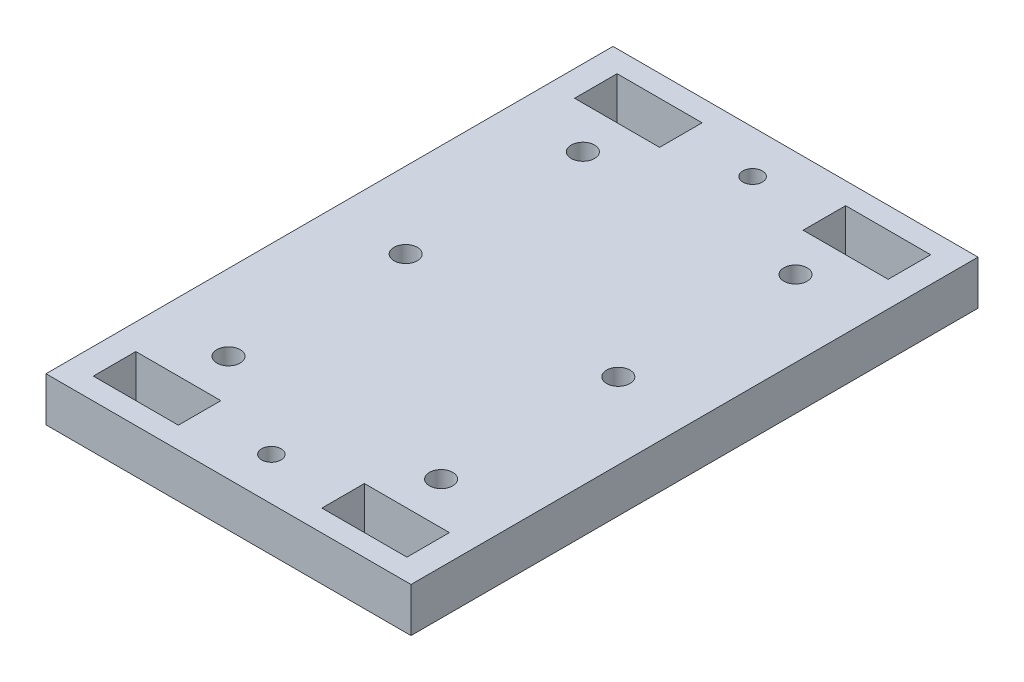
ISO-10303-21;
HEADER;
FILE_DESCRIPTION(('STEP AP214'),'2;1');
FILE_NAME('part.step','',(''),(''),'','','');
FILE_SCHEMA(('AUTOMOTIVE_DESIGN { 1 0 10303 214 1 1 1 1 }'));
ENDSEC;
DATA;
#1=APPLICATION_CONTEXT('core data for automotive mechanical design processes');
#2=APPLICATION_PROTOCOL_DEFINITION('international standard','automotive_design',2000,#1);
#3=PRODUCT_CONTEXT('',#1,'mechanical');
#4=PRODUCT('Part','Part','',(#3));
#5=PRODUCT_RELATED_PRODUCT_CATEGORY('part','',(#4));
#6=PRODUCT_DEFINITION_FORMATION('','',#4);
#7=PRODUCT_DEFINITION_CONTEXT('part definition',#1,'design');
#8=PRODUCT_DEFINITION('design','',#6,#7);
#9=PRODUCT_DEFINITION_SHAPE('','',#8);
#10=(LENGTH_UNIT() NAMED_UNIT(*) SI_UNIT(.MILLI.,.METRE.));
#11=(NAMED_UNIT(*) PLANE_ANGLE_UNIT() SI_UNIT($,.RADIAN.));
#12=(NAMED_UNIT(*) SI_UNIT($,.STERADIAN.) SOLID_ANGLE_UNIT());
#13=UNCERTAINTY_MEASURE_WITH_UNIT(LENGTH_MEASURE(1.E-05),#10,'distance_accuracy_value','');
#14=(GEOMETRIC_REPRESENTATION_CONTEXT(3) GLOBAL_UNCERTAINTY_ASSIGNED_CONTEXT((#13)) GLOBAL_UNIT_ASSIGNED_CONTEXT((#10,
#11,#12)) REPRESENTATION_CONTEXT('',''));
#15=CARTESIAN_POINT('',(0.,0.,0.));
#16=DIRECTION('',(0.,0.,1.));
#17=DIRECTION('',(1.,0.,0.));
#18=AXIS2_PLACEMENT_3D('',#15,#16,#17);
#19=CARTESIAN_POINT('',(0.,6.25,0.));
#20=DIRECTION('',(0.,-1.,0.));
#21=DIRECTION('',(0.,0.,-1.));
#22=AXIS2_PLACEMENT_3D('',#19,#20,#21);
#23=PLANE('',#22);
#24=CARTESIAN_POINT('',(25.75,6.25,-73.95));
#25=DIRECTION('',(0.,1.,0.));
#26=DIRECTION('',(0.,0.,1.));
#27=AXIS2_PLACEMENT_3D('',#24,#25,#26);
#28=CIRCLE('',#27,1.375);
#29=CARTESIAN_POINT('',(25.75,6.25,-72.575));
#30=VERTEX_POINT('',#29);
#31=EDGE_CURVE('E198',#30,#30,#28,.T.);
#32=ORIENTED_EDGE('',*,*,#31,.F.);
#33=EDGE_LOOP('',(#32));
#34=FACE_BOUND('',#33,.T.);
#35=DIRECTION('',(-1.,0.,0.));
#36=VECTOR('',#35,1.);
#37=CARTESIAN_POINT('',(15.6250000000001,6.25,-76.95));
#38=LINE('',#37,#36);
#39=CARTESIAN_POINT('',(15.6250000000001,6.25,-76.95));
#40=VERTEX_POINT('',#39);
#41=CARTESIAN_POINT('',(3.62500000000013,6.25,-76.95));
#42=VERTEX_POINT('',#41);
#43=EDGE_CURVE('E208',#40,#42,#38,.T.);
#44=ORIENTED_EDGE('',*,*,#43,.F.);
#45=DIRECTION('',(0.,0.,-1.));
#46=VECTOR('',#45,1.);
#47=CARTESIAN_POINT('',(15.6250000000001,6.25,-76.95));
#48=LINE('',#47,#46);
#49=CARTESIAN_POINT('',(15.6250000000001,6.25,-70.95));
#50=VERTEX_POINT('',#49);
#51=EDGE_CURVE('E216',#50,#40,#48,.T.);
#52=ORIENTED_EDGE('',*,*,#51,.F.);
#53=DIRECTION('',(1.,0.,0.));
#54=VECTOR('',#53,1.);
#55=CARTESIAN_POINT('',(15.6250000000001,6.25,-70.95));
#56=LINE('',#55,#54);
#57=CARTESIAN_POINT('',(3.62500000000011,6.25,-70.9500000000001));
#58=VERTEX_POINT('',#57);
#59=EDGE_CURVE('E213',#58,#50,#56,.T.);
#60=ORIENTED_EDGE('',*,*,#59,.F.);
#61=DIRECTION('',(0.,0.,1.));
#62=VECTOR('',#61,1.);
#63=CARTESIAN_POINT('',(3.62500000000013,6.25,-76.95));
#64=LINE('',#63,#62);
#65=EDGE_CURVE('E210',#42,#58,#64,.T.);
#66=ORIENTED_EDGE('',*,*,#65,.F.);
#67=EDGE_LOOP('',(#44,#52,#60,#66));
#68=FACE_BOUND('',#67,.T.);
#69=CARTESIAN_POINT('',(10.7499999999999,6.25,-65.));
#70=DIRECTION('',(0.,1.,0.));
#71=DIRECTION('',(0.,0.,1.));
#72=AXIS2_PLACEMENT_3D('',#69,#70,#71);
#73=CIRCLE('',#72,1.65);
#74=CARTESIAN_POINT('',(10.7499999999999,6.25,-63.35));
#75=VERTEX_POINT('',#74);
#76=EDGE_CURVE('E270',#75,#75,#73,.T.);
#77=ORIENTED_EDGE('',*,*,#76,.F.);
#78=EDGE_LOOP('',(#77));
#79=FACE_BOUND('',#78,.T.);
#80=CARTESIAN_POINT('',(40.7499999999999,6.25,-65.));
#81=DIRECTION('',(0.,1.,0.));
#82=DIRECTION('',(0.,0.,1.));
#83=AXIS2_PLACEMENT_3D('',#80,#81,#82);
#84=CIRCLE('',#83,1.65);
#85=CARTESIAN_POINT('',(40.7499999999999,6.25,-63.35));
#86=VERTEX_POINT('',#85);
#87=EDGE_CURVE('E282',#86,#86,#84,.T.);
#88=ORIENTED_EDGE('',*,*,#87,.F.);
#89=EDGE_LOOP('',(#88));
#90=FACE_BOUND('',#89,.T.);
#91=CARTESIAN_POINT('',(40.75,6.25,-40.));
#92=DIRECTION('',(0.,1.,0.));
#93=DIRECTION('',(0.,0.,1.));
#94=AXIS2_PLACEMENT_3D('',#91,#92,#93);
#95=CIRCLE('',#94,1.65);
#96=CARTESIAN_POINT('',(40.75,6.25,-38.35));
#97=VERTEX_POINT('',#96);
#98=EDGE_CURVE('E319',#97,#97,#95,.T.);
#99=ORIENTED_EDGE('',*,*,#98,.F.);
#100=EDGE_LOOP('',(#99));
#101=FACE_BOUND('',#100,.T.);
#102=CARTESIAN_POINT('',(10.7500000000001,6.25,-15.));
#103=DIRECTION('',(0.,1.,0.));
#104=DIRECTION('',(0.,0.,1.));
#105=AXIS2_PLACEMENT_3D('',#102,#103,#104);
#106=CIRCLE('',#105,1.65);
#107=CARTESIAN_POINT('',(10.7500000000001,6.25,-13.35));
#108=VERTEX_POINT('',#107);
#109=EDGE_CURVE('E331',#108,#108,#106,.T.);
#110=ORIENTED_EDGE('',*,*,#109,.F.);
#111=EDGE_LOOP('',(#110));
#112=FACE_BOUND('',#111,.T.);
#113=DIRECTION('',(0.,0.,1.));
#114=VECTOR('',#113,1.);
#115=CARTESIAN_POINT('',(0.,6.25,0.));
#116=LINE('',#115,#114);
#117=CARTESIAN_POINT('',(0.,6.25,-80.));
#118=VERTEX_POINT('',#117);
#119=CARTESIAN_POINT('',(0.,6.25,0.));
#120=VERTEX_POINT('',#119);
#121=EDGE_CURVE('E337',#118,#120,#116,.T.);
#122=ORIENTED_EDGE('',*,*,#121,.T.);
#123=DIRECTION('',(1.,0.,0.));
#124=VECTOR('',#123,1.);
#125=CARTESIAN_POINT('',(0.,6.25,0.));
#126=LINE('',#125,#124);
#127=CARTESIAN_POINT('',(51.5,6.25,0.));
#128=VERTEX_POINT('',#127);
#129=EDGE_CURVE('E340',#120,#128,#126,.T.);
#130=ORIENTED_EDGE('',*,*,#129,.T.);
#131=DIRECTION('',(0.,0.,-1.));
#132=VECTOR('',#131,1.);
#133=CARTESIAN_POINT('',(51.5,6.25,0.));
#134=LINE('',#133,#132);
#135=CARTESIAN_POINT('',(51.5,6.25,-80.));
#136=VERTEX_POINT('',#135);
#137=EDGE_CURVE('E343',#128,#136,#134,.T.);
#138=ORIENTED_EDGE('',*,*,#137,.T.);
#139=DIRECTION('',(-1.,0.,0.));
#140=VECTOR('',#139,1.);
#141=CARTESIAN_POINT('',(0.,6.25,-80.));
#142=LINE('',#141,#140);
#143=EDGE_CURVE('E345',#136,#118,#142,.T.);
#144=ORIENTED_EDGE('',*,*,#143,.T.);
#145=EDGE_LOOP('',(#122,#130,#138,#144));
#146=FACE_BOUND('',#145,.T.);
#147=CARTESIAN_POINT('',(40.7500000000001,6.25,-15.));
#148=DIRECTION('',(0.,1.,0.));
#149=DIRECTION('',(0.,0.,1.));
#150=AXIS2_PLACEMENT_3D('',#147,#148,#149);
#151=CIRCLE('',#150,1.65);
#152=CARTESIAN_POINT('',(40.7500000000001,6.25,-13.35));
#153=VERTEX_POINT('',#152);
#154=EDGE_CURVE('E325',#153,#153,#151,.T.);
#155=ORIENTED_EDGE('',*,*,#154,.F.);
#156=EDGE_LOOP('',(#155));
#157=FACE_BOUND('',#156,.T.);
#158=DIRECTION('',(0.,0.,-1.));
#159=VECTOR('',#158,1.);
#160=CARTESIAN_POINT('',(47.8749999999999,6.25,-76.95));
#161=LINE('',#160,#159);
#162=CARTESIAN_POINT('',(47.8749999999999,6.25,-70.9500000000001));
#163=VERTEX_POINT('',#162);
#164=CARTESIAN_POINT('',(47.8749999999999,6.25,-76.95));
#165=VERTEX_POINT('',#164);
#166=EDGE_CURVE('E288',#163,#165,#161,.T.);
#167=ORIENTED_EDGE('',*,*,#166,.F.);
#168=DIRECTION('',(1.,0.,0.));
#169=VECTOR('',#168,1.);
#170=CARTESIAN_POINT('',(35.8749999999999,6.25,-70.95));
#171=LINE('',#170,#169);
#172=CARTESIAN_POINT('',(35.8749999999999,6.25,-70.95));
#173=VERTEX_POINT('',#172);
#174=EDGE_CURVE('E296',#173,#163,#171,.T.);
#175=ORIENTED_EDGE('',*,*,#174,.F.);
#176=DIRECTION('',(0.,0.,1.));
#177=VECTOR('',#176,1.);
#178=CARTESIAN_POINT('',(35.8749999999999,6.25,-76.95));
#179=LINE('',#178,#177);
#180=CARTESIAN_POINT('',(35.8749999999999,6.25,-76.95));
#181=VERTEX_POINT('',#180);
#182=EDGE_CURVE('E293',#181,#173,#179,.T.);
#183=ORIENTED_EDGE('',*,*,#182,.F.);
#184=DIRECTION('',(-1.,0.,0.));
#185=VECTOR('',#184,1.);
#186=CARTESIAN_POINT('',(35.8749999999999,6.25,-76.95));
#187=LINE('',#186,#185);
#188=EDGE_CURVE('E290',#165,#181,#187,.T.);
#189=ORIENTED_EDGE('',*,*,#188,.F.);
#190=EDGE_LOOP('',(#167,#175,#183,#189));
#191=FACE_BOUND('',#190,.T.);
#192=CARTESIAN_POINT('',(10.75,6.25,-40.));
#193=DIRECTION('',(0.,1.,0.));
#194=DIRECTION('',(0.,0.,1.));
#195=AXIS2_PLACEMENT_3D('',#192,#193,#194);
#196=CIRCLE('',#195,1.65);
#197=CARTESIAN_POINT('',(10.75,6.25,-38.35));
#198=VERTEX_POINT('',#197);
#199=EDGE_CURVE('E276',#198,#198,#196,.T.);
#200=ORIENTED_EDGE('',*,*,#199,.F.);
#201=EDGE_LOOP('',(#200));
#202=FACE_BOUND('',#201,.T.);
#203=DIRECTION('',(1.,0.,0.));
#204=VECTOR('',#203,1.);
#205=CARTESIAN_POINT('',(35.8749999999999,6.25,-3.04999999999997));
#206=LINE('',#205,#204);
#207=CARTESIAN_POINT('',(35.8749999999999,6.25,-3.04999999999997));
#208=VERTEX_POINT('',#207);
#209=CARTESIAN_POINT('',(47.8749999999999,6.25,-3.04999999999996));
#210=VERTEX_POINT('',#209);
#211=EDGE_CURVE('E239',#208,#210,#206,.T.);
#212=ORIENTED_EDGE('',*,*,#211,.F.);
#213=DIRECTION('',(0.,0.,1.));
#214=VECTOR('',#213,1.);
#215=CARTESIAN_POINT('',(35.8749999999999,6.25,-3.04999999999997));
#216=LINE('',#215,#214);
#217=CARTESIAN_POINT('',(35.8749999999999,6.25,-9.04999999999996));
#218=VERTEX_POINT('',#217);
#219=EDGE_CURVE('E247',#218,#208,#216,.T.);
#220=ORIENTED_EDGE('',*,*,#219,.F.);
#221=DIRECTION('',(-1.,0.,0.));
#222=VECTOR('',#221,1.);
#223=CARTESIAN_POINT('',(35.8749999999999,6.25,-9.04999999999996));
#224=LINE('',#223,#222);
#225=CARTESIAN_POINT('',(47.8749999999999,6.25,-9.04999999999995));
#226=VERTEX_POINT('',#225);
#227=EDGE_CURVE('E244',#226,#218,#224,.T.);
#228=ORIENTED_EDGE('',*,*,#227,.F.);
#229=DIRECTION('',(0.,0.,-1.));
#230=VECTOR('',#229,1.);
#231=CARTESIAN_POINT('',(47.8749999999999,6.25,-3.04999999999996));
#232=LINE('',#231,#230);
#233=EDGE_CURVE('E241',#210,#226,#232,.T.);
#234=ORIENTED_EDGE('',*,*,#233,.F.);
#235=EDGE_LOOP('',(#212,#220,#228,#234));
#236=FACE_BOUND('',#235,.T.);
#237=DIRECTION('',(1.,0.,0.));
#238=VECTOR('',#237,1.);
#239=CARTESIAN_POINT('',(15.6250000000001,6.25,-3.04999999999997));
#240=LINE('',#239,#238);
#241=CARTESIAN_POINT('',(3.62500000000013,6.25,-3.04999999999996));
#242=VERTEX_POINT('',#241);
#243=CARTESIAN_POINT('',(15.6250000000001,6.25,-3.04999999999997));
#244=VERTEX_POINT('',#243);
#245=EDGE_CURVE('E169',#242,#244,#240,.T.);
#246=ORIENTED_EDGE('',*,*,#245,.F.);
#247=DIRECTION('',(0.,0.,1.));
#248=VECTOR('',#247,1.);
#249=CARTESIAN_POINT('',(3.62500000000013,6.25,-3.04999999999996));
#250=LINE('',#249,#248);
#251=CARTESIAN_POINT('',(3.62500000000011,6.25,-9.04999999999995));
#252=VERTEX_POINT('',#251);
#253=EDGE_CURVE('E192',#252,#242,#250,.T.);
#254=ORIENTED_EDGE('',*,*,#253,.F.);
#255=DIRECTION('',(-1.,0.,0.));
#256=VECTOR('',#255,1.);
#257=CARTESIAN_POINT('',(15.6250000000001,6.25,-9.04999999999996));
#258=LINE('',#257,#256);
#259=CARTESIAN_POINT('',(15.6250000000001,6.25,-9.04999999999996));
#260=VERTEX_POINT('',#259);
#261=EDGE_CURVE('E190',#260,#252,#258,.T.);
#262=ORIENTED_EDGE('',*,*,#261,.F.);
#263=DIRECTION('',(0.,0.,-1.));
#264=VECTOR('',#263,1.);
#265=CARTESIAN_POINT('',(15.6250000000001,6.25,-3.04999999999997));
#266=LINE('',#265,#264);
#267=EDGE_CURVE('E177',#244,#260,#266,.T.);
#268=ORIENTED_EDGE('',*,*,#267,.F.);
#269=EDGE_LOOP('',(#246,#254,#262,#268));
#270=FACE_BOUND('',#269,.T.);
#271=CARTESIAN_POINT('',(25.75,6.25,-6.05));
#272=DIRECTION('',(0.,1.,0.));
#273=DIRECTION('',(0.,0.,1.));
#274=AXIS2_PLACEMENT_3D('',#271,#272,#273);
#275=CIRCLE('',#274,1.375);
#276=CARTESIAN_POINT('',(25.75,6.25,-4.675));
#277=VERTEX_POINT('',#276);
#278=EDGE_CURVE('E508',#277,#277,#275,.T.);
#279=ORIENTED_EDGE('',*,*,#278,.F.);
#280=EDGE_LOOP('',(#279));
#281=FACE_BOUND('',#280,.T.);
#282=ADVANCED_FACE('F32',(#34,#68,#79,#90,#101,#112,#146,#157,#191,#202,#236,#270,#281),#23,.F.);
#283=CARTESIAN_POINT('',(0.,0.,0.));
#284=DIRECTION('',(0.,-1.,0.));
#285=DIRECTION('',(0.,0.,-1.));
#286=AXIS2_PLACEMENT_3D('',#283,#284,#285);
#287=PLANE('',#286);
#288=CARTESIAN_POINT('',(25.75,0.,-73.95));
#289=DIRECTION('',(0.,1.,0.));
#290=DIRECTION('',(0.,0.,1.));
#291=AXIS2_PLACEMENT_3D('',#288,#289,#290);
#292=CIRCLE('',#291,1.375);
#293=CARTESIAN_POINT('',(25.75,0.,-72.575));
#294=VERTEX_POINT('',#293);
#295=EDGE_CURVE('E514',#294,#294,#292,.T.);
#296=ORIENTED_EDGE('',*,*,#295,.T.);
#297=EDGE_LOOP('',(#296));
#298=FACE_BOUND('',#297,.T.);
#299=DIRECTION('',(0.,0.,-1.));
#300=VECTOR('',#299,1.);
#301=CARTESIAN_POINT('',(15.6250000000001,0.,-76.95));
#302=LINE('',#301,#300);
#303=CARTESIAN_POINT('',(15.6250000000001,0.,-70.95));
#304=VERTEX_POINT('',#303);
#305=CARTESIAN_POINT('',(15.6250000000001,0.,-76.95));
#306=VERTEX_POINT('',#305);
#307=EDGE_CURVE('E211',#304,#306,#302,.T.);
#308=ORIENTED_EDGE('',*,*,#307,.T.);
#309=DIRECTION('',(-1.,0.,0.));
#310=VECTOR('',#309,1.);
#311=CARTESIAN_POINT('',(15.6250000000001,0.,-76.95));
#312=LINE('',#311,#310);
#313=CARTESIAN_POINT('',(3.62500000000013,0.,-76.95));
#314=VERTEX_POINT('',#313);
#315=EDGE_CURVE('E185',#306,#314,#312,.T.);
#316=ORIENTED_EDGE('',*,*,#315,.T.);
#317=DIRECTION('',(0.,0.,1.));
#318=VECTOR('',#317,1.);
#319=CARTESIAN_POINT('',(3.62500000000013,0.,-76.95));
#320=LINE('',#319,#318);
#321=CARTESIAN_POINT('',(3.62500000000011,0.,-70.9500000000001));
#322=VERTEX_POINT('',#321);
#323=EDGE_CURVE('E221',#314,#322,#320,.T.);
#324=ORIENTED_EDGE('',*,*,#323,.T.);
#325=DIRECTION('',(1.,0.,0.));
#326=VECTOR('',#325,1.);
#327=CARTESIAN_POINT('',(15.6250000000001,0.,-70.95));
#328=LINE('',#327,#326);
#329=EDGE_CURVE('E224',#322,#304,#328,.T.);
#330=ORIENTED_EDGE('',*,*,#329,.T.);
#331=EDGE_LOOP('',(#308,#316,#324,#330));
#332=FACE_BOUND('',#331,.T.);
#333=CARTESIAN_POINT('',(10.7499999999999,0.,-65.));
#334=DIRECTION('',(0.,1.,0.));
#335=DIRECTION('',(0.,0.,1.));
#336=AXIS2_PLACEMENT_3D('',#333,#334,#335);
#337=CIRCLE('',#336,1.65);
#338=CARTESIAN_POINT('',(10.7499999999999,0.,-63.35));
#339=VERTEX_POINT('',#338);
#340=EDGE_CURVE('E269',#339,#339,#337,.T.);
#341=ORIENTED_EDGE('',*,*,#340,.T.);
#342=EDGE_LOOP('',(#341));
#343=FACE_BOUND('',#342,.T.);
#344=CARTESIAN_POINT('',(40.7499999999999,0.,-65.));
#345=DIRECTION('',(0.,1.,0.));
#346=DIRECTION('',(0.,0.,1.));
#347=AXIS2_PLACEMENT_3D('',#344,#345,#346);
#348=CIRCLE('',#347,1.65);
#349=CARTESIAN_POINT('',(40.7499999999999,0.,-63.35));
#350=VERTEX_POINT('',#349);
#351=EDGE_CURVE('E279',#350,#350,#348,.T.);
#352=ORIENTED_EDGE('',*,*,#351,.T.);
#353=EDGE_LOOP('',(#352));
#354=FACE_BOUND('',#353,.T.);
#355=CARTESIAN_POINT('',(40.75,0.,-40.));
#356=DIRECTION('',(0.,1.,0.));
#357=DIRECTION('',(0.,0.,1.));
#358=AXIS2_PLACEMENT_3D('',#355,#356,#357);
#359=CIRCLE('',#358,1.65);
#360=CARTESIAN_POINT('',(40.75,0.,-38.35));
#361=VERTEX_POINT('',#360);
#362=EDGE_CURVE('E318',#361,#361,#359,.T.);
#363=ORIENTED_EDGE('',*,*,#362,.T.);
#364=EDGE_LOOP('',(#363));
#365=FACE_BOUND('',#364,.T.);
#366=CARTESIAN_POINT('',(10.7500000000001,0.,-15.));
#367=DIRECTION('',(0.,1.,0.));
#368=DIRECTION('',(0.,0.,1.));
#369=AXIS2_PLACEMENT_3D('',#366,#367,#368);
#370=CIRCLE('',#369,1.65);
#371=CARTESIAN_POINT('',(10.7500000000001,0.,-13.35));
#372=VERTEX_POINT('',#371);
#373=EDGE_CURVE('E328',#372,#372,#370,.T.);
#374=ORIENTED_EDGE('',*,*,#373,.T.);
#375=EDGE_LOOP('',(#374));
#376=FACE_BOUND('',#375,.T.);
#377=DIRECTION('',(0.,0.,1.));
#378=VECTOR('',#377,1.);
#379=CARTESIAN_POINT('',(0.,0.,0.));
#380=LINE('',#379,#378);
#381=CARTESIAN_POINT('',(0.,0.,-80.));
#382=VERTEX_POINT('',#381);
#383=CARTESIAN_POINT('',(0.,0.,0.));
#384=VERTEX_POINT('',#383);
#385=EDGE_CURVE('E334',#382,#384,#380,.T.);
#386=ORIENTED_EDGE('',*,*,#385,.F.);
#387=DIRECTION('',(-1.,0.,0.));
#388=VECTOR('',#387,1.);
#389=CARTESIAN_POINT('',(0.,0.,-80.));
#390=LINE('',#389,#388);
#391=CARTESIAN_POINT('',(51.5,0.,-80.));
#392=VERTEX_POINT('',#391);
#393=EDGE_CURVE('E341',#392,#382,#390,.T.);
#394=ORIENTED_EDGE('',*,*,#393,.F.);
#395=DIRECTION('',(0.,0.,-1.));
#396=VECTOR('',#395,1.);
#397=CARTESIAN_POINT('',(51.5,0.,0.));
#398=LINE('',#397,#396);
#399=CARTESIAN_POINT('',(51.5,0.,0.));
#400=VERTEX_POINT('',#399);
#401=EDGE_CURVE('E352',#400,#392,#398,.T.);
#402=ORIENTED_EDGE('',*,*,#401,.F.);
#403=DIRECTION('',(1.,0.,0.));
#404=VECTOR('',#403,1.);
#405=CARTESIAN_POINT('',(0.,0.,0.));
#406=LINE('',#405,#404);
#407=EDGE_CURVE('E350',#384,#400,#406,.T.);
#408=ORIENTED_EDGE('',*,*,#407,.F.);
#409=EDGE_LOOP('',(#386,#394,#402,#408));
#410=FACE_BOUND('',#409,.T.);
#411=CARTESIAN_POINT('',(40.7500000000001,0.,-15.));
#412=DIRECTION('',(0.,1.,0.));
#413=DIRECTION('',(0.,0.,1.));
#414=AXIS2_PLACEMENT_3D('',#411,#412,#413);
#415=CIRCLE('',#414,1.65);
#416=CARTESIAN_POINT('',(40.7500000000001,0.,-13.35));
#417=VERTEX_POINT('',#416);
#418=EDGE_CURVE('E322',#417,#417,#415,.T.);
#419=ORIENTED_EDGE('',*,*,#418,.T.);
#420=EDGE_LOOP('',(#419));
#421=FACE_BOUND('',#420,.T.);
#422=DIRECTION('',(1.,0.,0.));
#423=VECTOR('',#422,1.);
#424=CARTESIAN_POINT('',(35.8749999999999,0.,-70.95));
#425=LINE('',#424,#423);
#426=CARTESIAN_POINT('',(35.8749999999999,0.,-70.95));
#427=VERTEX_POINT('',#426);
#428=CARTESIAN_POINT('',(47.8749999999999,0.,-70.9500000000001));
#429=VERTEX_POINT('',#428);
#430=EDGE_CURVE('E291',#427,#429,#425,.T.);
#431=ORIENTED_EDGE('',*,*,#430,.T.);
#432=DIRECTION('',(0.,0.,-1.));
#433=VECTOR('',#432,1.);
#434=CARTESIAN_POINT('',(47.8749999999999,0.,-76.95));
#435=LINE('',#434,#433);
#436=CARTESIAN_POINT('',(47.8749999999999,0.,-76.95));
#437=VERTEX_POINT('',#436);
#438=EDGE_CURVE('E285',#429,#437,#435,.T.);
#439=ORIENTED_EDGE('',*,*,#438,.T.);
#440=DIRECTION('',(-1.,0.,0.));
#441=VECTOR('',#440,1.);
#442=CARTESIAN_POINT('',(35.8749999999999,0.,-76.95));
#443=LINE('',#442,#441);
#444=CARTESIAN_POINT('',(35.8749999999999,0.,-76.95));
#445=VERTEX_POINT('',#444);
#446=EDGE_CURVE('E301',#437,#445,#443,.T.);
#447=ORIENTED_EDGE('',*,*,#446,.T.);
#448=DIRECTION('',(0.,0.,1.));
#449=VECTOR('',#448,1.);
#450=CARTESIAN_POINT('',(35.8749999999999,0.,-76.95));
#451=LINE('',#450,#449);
#452=EDGE_CURVE('E304',#445,#427,#451,.T.);
#453=ORIENTED_EDGE('',*,*,#452,.T.);
#454=EDGE_LOOP('',(#431,#439,#447,#453));
#455=FACE_BOUND('',#454,.T.);
#456=CARTESIAN_POINT('',(10.75,0.,-40.));
#457=DIRECTION('',(0.,1.,0.));
#458=DIRECTION('',(0.,0.,1.));
#459=AXIS2_PLACEMENT_3D('',#456,#457,#458);
#460=CIRCLE('',#459,1.65);
#461=CARTESIAN_POINT('',(10.75,0.,-38.35));
#462=VERTEX_POINT('',#461);
#463=EDGE_CURVE('E273',#462,#462,#460,.T.);
#464=ORIENTED_EDGE('',*,*,#463,.T.);
#465=EDGE_LOOP('',(#464));
#466=FACE_BOUND('',#465,.T.);
#467=DIRECTION('',(0.,0.,1.));
#468=VECTOR('',#467,1.);
#469=CARTESIAN_POINT('',(35.8749999999999,0.,-3.04999999999997));
#470=LINE('',#469,#468);
#471=CARTESIAN_POINT('',(35.8749999999999,0.,-9.04999999999996));
#472=VERTEX_POINT('',#471);
#473=CARTESIAN_POINT('',(35.8749999999999,0.,-3.04999999999997));
#474=VERTEX_POINT('',#473);
#475=EDGE_CURVE('E242',#472,#474,#470,.T.);
#476=ORIENTED_EDGE('',*,*,#475,.T.);
#477=DIRECTION('',(1.,0.,0.));
#478=VECTOR('',#477,1.);
#479=CARTESIAN_POINT('',(35.8749999999999,0.,-3.04999999999997));
#480=LINE('',#479,#478);
#481=CARTESIAN_POINT('',(47.8749999999999,0.,-3.04999999999996));
#482=VERTEX_POINT('',#481);
#483=EDGE_CURVE('E238',#474,#482,#480,.T.);
#484=ORIENTED_EDGE('',*,*,#483,.T.);
#485=DIRECTION('',(0.,0.,-1.));
#486=VECTOR('',#485,1.);
#487=CARTESIAN_POINT('',(47.8749999999999,0.,-3.04999999999996));
#488=LINE('',#487,#486);
#489=CARTESIAN_POINT('',(47.8749999999999,0.,-9.04999999999995));
#490=VERTEX_POINT('',#489);
#491=EDGE_CURVE('E252',#482,#490,#488,.T.);
#492=ORIENTED_EDGE('',*,*,#491,.T.);
#493=DIRECTION('',(-1.,0.,0.));
#494=VECTOR('',#493,1.);
#495=CARTESIAN_POINT('',(35.8749999999999,0.,-9.04999999999996));
#496=LINE('',#495,#494);
#497=EDGE_CURVE('E255',#490,#472,#496,.T.);
#498=ORIENTED_EDGE('',*,*,#497,.T.);
#499=EDGE_LOOP('',(#476,#484,#492,#498));
#500=FACE_BOUND('',#499,.T.);
#501=DIRECTION('',(0.,0.,1.));
#502=VECTOR('',#501,1.);
#503=CARTESIAN_POINT('',(3.62500000000013,0.,-3.04999999999996));
#504=LINE('',#503,#502);
#505=CARTESIAN_POINT('',(3.62500000000011,0.,-9.04999999999995));
#506=VERTEX_POINT('',#505);
#507=CARTESIAN_POINT('',(3.62500000000013,0.,-3.04999999999996));
#508=VERTEX_POINT('',#507);
#509=EDGE_CURVE('E178',#506,#508,#504,.T.);
#510=ORIENTED_EDGE('',*,*,#509,.T.);
#511=DIRECTION('',(1.,0.,0.));
#512=VECTOR('',#511,1.);
#513=CARTESIAN_POINT('',(15.6250000000001,0.,-3.04999999999997));
#514=LINE('',#513,#512);
#515=CARTESIAN_POINT('',(15.6250000000001,0.,-3.04999999999997));
#516=VERTEX_POINT('',#515);
#517=EDGE_CURVE('E55',#508,#516,#514,.T.);
#518=ORIENTED_EDGE('',*,*,#517,.T.);
#519=DIRECTION('',(0.,0.,-1.));
#520=VECTOR('',#519,1.);
#521=CARTESIAN_POINT('',(15.6250000000001,0.,-3.04999999999997));
#522=LINE('',#521,#520);
#523=CARTESIAN_POINT('',(15.6250000000001,0.,-9.04999999999996));
#524=VERTEX_POINT('',#523);
#525=EDGE_CURVE('E184',#516,#524,#522,.T.);
#526=ORIENTED_EDGE('',*,*,#525,.T.);
#527=DIRECTION('',(-1.,0.,0.));
#528=VECTOR('',#527,1.);
#529=CARTESIAN_POINT('',(15.6250000000001,0.,-9.04999999999996));
#530=LINE('',#529,#528);
#531=EDGE_CURVE('E200',#524,#506,#530,.T.);
#532=ORIENTED_EDGE('',*,*,#531,.T.);
#533=EDGE_LOOP('',(#510,#518,#526,#532));
#534=FACE_BOUND('',#533,.T.);
#535=CARTESIAN_POINT('',(25.75,0.,-6.05));
#536=DIRECTION('',(0.,1.,0.));
#537=DIRECTION('',(0.,0.,1.));
#538=AXIS2_PLACEMENT_3D('',#535,#536,#537);
#539=CIRCLE('',#538,1.375);
#540=CARTESIAN_POINT('',(25.75,0.,-4.675));
#541=VERTEX_POINT('',#540);
#542=EDGE_CURVE('E511',#541,#541,#539,.T.);
#543=ORIENTED_EDGE('',*,*,#542,.T.);
#544=EDGE_LOOP('',(#543));
#545=FACE_BOUND('',#544,.T.);
#546=ADVANCED_FACE('F370',(#298,#332,#343,#354,#365,#376,#410,#421,#455,#466,#500,#534,#545),
#287,.T.);
#547=CARTESIAN_POINT('',(0.,6.25,0.));
#548=DIRECTION('',(1.,0.,0.));
#549=DIRECTION('',(0.,0.,-1.));
#550=AXIS2_PLACEMENT_3D('',#547,#548,#549);
#551=PLANE('',#550);
#552=ORIENTED_EDGE('',*,*,#385,.T.);
#553=DIRECTION('',(0.,-1.,0.));
#554=VECTOR('',#553,1.);
#555=CARTESIAN_POINT('',(0.,6.25,0.));
#556=LINE('',#555,#554);
#557=EDGE_CURVE('E11',#120,#384,#556,.T.);
#558=ORIENTED_EDGE('',*,*,#557,.F.);
#559=ORIENTED_EDGE('',*,*,#121,.F.);
#560=DIRECTION('',(0.,-1.,0.));
#561=VECTOR('',#560,1.);
#562=CARTESIAN_POINT('',(0.,6.25,-80.));
#563=LINE('',#562,#561);
#564=EDGE_CURVE('E347',#118,#382,#563,.T.);
#565=ORIENTED_EDGE('',*,*,#564,.T.);
#566=EDGE_LOOP('',(#552,#558,#559,#565));
#567=FACE_BOUND('',#566,.T.);
#568=ADVANCED_FACE('F34',(#567),#551,.F.);
#569=CARTESIAN_POINT('',(0.,6.25,0.));
#570=DIRECTION('',(0.,0.,-1.));
#571=DIRECTION('',(-1.,0.,0.));
#572=AXIS2_PLACEMENT_3D('',#569,#570,#571);
#573=PLANE('',#572);
#574=ORIENTED_EDGE('',*,*,#407,.T.);
#575=DIRECTION('',(0.,-1.,0.));
#576=VECTOR('',#575,1.);
#577=CARTESIAN_POINT('',(51.5,6.25,0.));
#578=LINE('',#577,#576);
#579=EDGE_CURVE('E40',#128,#400,#578,.T.);
#580=ORIENTED_EDGE('',*,*,#579,.F.);
#581=ORIENTED_EDGE('',*,*,#129,.F.);
#582=ORIENTED_EDGE('',*,*,#557,.T.);
#583=EDGE_LOOP('',(#574,#580,#581,#582));
#584=FACE_BOUND('',#583,.T.);
#585=ADVANCED_FACE('F381',(#584),#573,.F.);
#586=CARTESIAN_POINT('',(51.5,6.25,0.));
#587=DIRECTION('',(-1.,0.,0.));
#588=DIRECTION('',(0.,0.,1.));
#589=AXIS2_PLACEMENT_3D('',#586,#587,#588);
#590=PLANE('',#589);
#591=ORIENTED_EDGE('',*,*,#401,.T.);
#592=DIRECTION('',(0.,-1.,0.));
#593=VECTOR('',#592,1.);
#594=CARTESIAN_POINT('',(51.5,6.25,-80.));
#595=LINE('',#594,#593);
#596=EDGE_CURVE('E357',#136,#392,#595,.T.);
#597=ORIENTED_EDGE('',*,*,#596,.F.);
#598=ORIENTED_EDGE('',*,*,#137,.F.);
#599=ORIENTED_EDGE('',*,*,#579,.T.);
#600=EDGE_LOOP('',(#591,#597,#598,#599));
#601=FACE_BOUND('',#600,.T.);
#602=ADVANCED_FACE('F364',(#601),#590,.F.);
#603=CARTESIAN_POINT('',(0.,6.25,-80.));
#604=DIRECTION('',(0.,0.,1.));
#605=DIRECTION('',(1.,0.,0.));
#606=AXIS2_PLACEMENT_3D('',#603,#604,#605);
#607=PLANE('',#606);
#608=ORIENTED_EDGE('',*,*,#393,.T.);
#609=ORIENTED_EDGE('',*,*,#564,.F.);
#610=ORIENTED_EDGE('',*,*,#143,.F.);
#611=ORIENTED_EDGE('',*,*,#596,.T.);
#612=EDGE_LOOP('',(#608,#609,#610,#611));
#613=FACE_BOUND('',#612,.T.);
#614=ADVANCED_FACE('F374',(#613),#607,.F.);
#615=CARTESIAN_POINT('',(10.7500000000001,6.25,-15.));
#616=DIRECTION('',(0.,-1.,0.));
#617=DIRECTION('',(0.,0.,-1.));
#618=AXIS2_PLACEMENT_3D('',#615,#616,#617);
#619=CYLINDRICAL_SURFACE('',#618,1.65);
#620=ORIENTED_EDGE('',*,*,#109,.T.);
#621=EDGE_LOOP('',(#620));
#622=FACE_BOUND('',#621,.T.);
#623=ORIENTED_EDGE('',*,*,#373,.F.);
#624=EDGE_LOOP('',(#623));
#625=FACE_BOUND('',#624,.T.);
#626=ADVANCED_FACE('F399',(#622,#625),#619,.F.);
#627=CARTESIAN_POINT('',(40.7500000000001,6.25,-15.));
#628=DIRECTION('',(0.,-1.,0.));
#629=DIRECTION('',(0.,0.,-1.));
#630=AXIS2_PLACEMENT_3D('',#627,#628,#629);
#631=CYLINDRICAL_SURFACE('',#630,1.65);
#632=ORIENTED_EDGE('',*,*,#154,.T.);
#633=EDGE_LOOP('',(#632));
#634=FACE_BOUND('',#633,.T.);
#635=ORIENTED_EDGE('',*,*,#418,.F.);
#636=EDGE_LOOP('',(#635));
#637=FACE_BOUND('',#636,.T.);
#638=ADVANCED_FACE('F406',(#634,#637),#631,.F.);
#639=CARTESIAN_POINT('',(40.75,6.25,-40.));
#640=DIRECTION('',(0.,-1.,0.));
#641=DIRECTION('',(0.,0.,-1.));
#642=AXIS2_PLACEMENT_3D('',#639,#640,#641);
#643=CYLINDRICAL_SURFACE('',#642,1.65);
#644=ORIENTED_EDGE('',*,*,#98,.T.);
#645=EDGE_LOOP('',(#644));
#646=FACE_BOUND('',#645,.T.);
#647=ORIENTED_EDGE('',*,*,#362,.F.);
#648=EDGE_LOOP('',(#647));
#649=FACE_BOUND('',#648,.T.);
#650=ADVANCED_FACE('F411',(#646,#649),#643,.F.);
#651=CARTESIAN_POINT('',(47.8749999999999,6.25,-76.95));
#652=DIRECTION('',(-1.,0.,0.));
#653=DIRECTION('',(0.,0.,1.));
#654=AXIS2_PLACEMENT_3D('',#651,#652,#653);
#655=PLANE('',#654);
#656=ORIENTED_EDGE('',*,*,#438,.F.);
#657=DIRECTION('',(0.,-1.,0.));
#658=VECTOR('',#657,1.);
#659=CARTESIAN_POINT('',(47.8749999999999,6.25,-70.9500000000001));
#660=LINE('',#659,#658);
#661=EDGE_CURVE('E298',#163,#429,#660,.T.);
#662=ORIENTED_EDGE('',*,*,#661,.F.);
#663=ORIENTED_EDGE('',*,*,#166,.T.);
#664=DIRECTION('',(0.,-1.,0.));
#665=VECTOR('',#664,1.);
#666=CARTESIAN_POINT('',(47.8749999999999,6.25,-76.95));
#667=LINE('',#666,#665);
#668=EDGE_CURVE('E315',#165,#437,#667,.T.);
#669=ORIENTED_EDGE('',*,*,#668,.T.);
#670=EDGE_LOOP('',(#656,#662,#663,#669));
#671=FACE_BOUND('',#670,.T.);
#672=ADVANCED_FACE('F421',(#671),#655,.T.);
#673=CARTESIAN_POINT('',(35.8749999999999,6.25,-76.95));
#674=DIRECTION('',(0.,0.,1.));
#675=DIRECTION('',(1.,0.,0.));
#676=AXIS2_PLACEMENT_3D('',#673,#674,#675);
#677=PLANE('',#676);
#678=ORIENTED_EDGE('',*,*,#446,.F.);
#679=ORIENTED_EDGE('',*,*,#668,.F.);
#680=ORIENTED_EDGE('',*,*,#188,.T.);
#681=DIRECTION('',(0.,-1.,0.));
#682=VECTOR('',#681,1.);
#683=CARTESIAN_POINT('',(35.8749999999999,6.25,-76.95));
#684=LINE('',#683,#682);
#685=EDGE_CURVE('E313',#181,#445,#684,.T.);
#686=ORIENTED_EDGE('',*,*,#685,.T.);
#687=EDGE_LOOP('',(#678,#679,#680,#686));
#688=FACE_BOUND('',#687,.T.);
#689=ADVANCED_FACE('F428',(#688),#677,.T.);
#690=CARTESIAN_POINT('',(35.8749999999999,6.25,-76.95));
#691=DIRECTION('',(1.,0.,0.));
#692=DIRECTION('',(0.,0.,-1.));
#693=AXIS2_PLACEMENT_3D('',#690,#691,#692);
#694=PLANE('',#693);
#695=ORIENTED_EDGE('',*,*,#452,.F.);
#696=ORIENTED_EDGE('',*,*,#685,.F.);
#697=ORIENTED_EDGE('',*,*,#182,.T.);
#698=DIRECTION('',(0.,-1.,0.));
#699=VECTOR('',#698,1.);
#700=CARTESIAN_POINT('',(35.8749999999999,6.25,-70.95));
#701=LINE('',#700,#699);
#702=EDGE_CURVE('E311',#173,#427,#701,.T.);
#703=ORIENTED_EDGE('',*,*,#702,.T.);
#704=EDGE_LOOP('',(#695,#696,#697,#703));
#705=FACE_BOUND('',#704,.T.);
#706=ADVANCED_FACE('F432',(#705),#694,.T.);
#707=CARTESIAN_POINT('',(35.8749999999999,6.25,-70.95));
#708=DIRECTION('',(0.,0.,-1.));
#709=DIRECTION('',(-1.,0.,0.));
#710=AXIS2_PLACEMENT_3D('',#707,#708,#709);
#711=PLANE('',#710);
#712=ORIENTED_EDGE('',*,*,#430,.F.);
#713=ORIENTED_EDGE('',*,*,#702,.F.);
#714=ORIENTED_EDGE('',*,*,#174,.T.);
#715=ORIENTED_EDGE('',*,*,#661,.T.);
#716=EDGE_LOOP('',(#712,#713,#714,#715));
#717=FACE_BOUND('',#716,.T.);
#718=ADVANCED_FACE('F436',(#717),#711,.T.);
#719=CARTESIAN_POINT('',(40.7499999999999,6.25,-65.));
#720=DIRECTION('',(0.,-1.,0.));
#721=DIRECTION('',(0.,0.,-1.));
#722=AXIS2_PLACEMENT_3D('',#719,#720,#721);
#723=CYLINDRICAL_SURFACE('',#722,1.65);
#724=ORIENTED_EDGE('',*,*,#87,.T.);
#725=EDGE_LOOP('',(#724));
#726=FACE_BOUND('',#725,.T.);
#727=ORIENTED_EDGE('',*,*,#351,.F.);
#728=EDGE_LOOP('',(#727));
#729=FACE_BOUND('',#728,.T.);
#730=ADVANCED_FACE('F440',(#726,#729),#723,.F.);
#731=CARTESIAN_POINT('',(10.75,6.25,-40.));
#732=DIRECTION('',(0.,-1.,0.));
#733=DIRECTION('',(0.,0.,-1.));
#734=AXIS2_PLACEMENT_3D('',#731,#732,#733);
#735=CYLINDRICAL_SURFACE('',#734,1.65);
#736=ORIENTED_EDGE('',*,*,#199,.T.);
#737=EDGE_LOOP('',(#736));
#738=FACE_BOUND('',#737,.T.);
#739=ORIENTED_EDGE('',*,*,#463,.F.);
#740=EDGE_LOOP('',(#739));
#741=FACE_BOUND('',#740,.T.);
#742=ADVANCED_FACE('F444',(#738,#741),#735,.F.);
#743=CARTESIAN_POINT('',(10.7499999999999,6.25,-65.));
#744=DIRECTION('',(0.,-1.,0.));
#745=DIRECTION('',(0.,0.,-1.));
#746=AXIS2_PLACEMENT_3D('',#743,#744,#745);
#747=CYLINDRICAL_SURFACE('',#746,1.65);
#748=ORIENTED_EDGE('',*,*,#76,.T.);
#749=EDGE_LOOP('',(#748));
#750=FACE_BOUND('',#749,.T.);
#751=ORIENTED_EDGE('',*,*,#340,.F.);
#752=EDGE_LOOP('',(#751));
#753=FACE_BOUND('',#752,.T.);
#754=ADVANCED_FACE('F448',(#750,#753),#747,.F.);
#755=CARTESIAN_POINT('',(35.8749999999999,6.25,-3.04999999999997));
#756=DIRECTION('',(0.,0.,-1.));
#757=DIRECTION('',(-1.,0.,0.));
#758=AXIS2_PLACEMENT_3D('',#755,#756,#757);
#759=PLANE('',#758);
#760=ORIENTED_EDGE('',*,*,#483,.F.);
#761=DIRECTION('',(0.,-1.,0.));
#762=VECTOR('',#761,1.);
#763=CARTESIAN_POINT('',(35.8749999999999,6.25,-3.04999999999997));
#764=LINE('',#763,#762);
#765=EDGE_CURVE('E249',#208,#474,#764,.T.);
#766=ORIENTED_EDGE('',*,*,#765,.F.);
#767=ORIENTED_EDGE('',*,*,#211,.T.);
#768=DIRECTION('',(0.,-1.,0.));
#769=VECTOR('',#768,1.);
#770=CARTESIAN_POINT('',(47.8749999999999,6.25,-3.04999999999996));
#771=LINE('',#770,#769);
#772=EDGE_CURVE('E266',#210,#482,#771,.T.);
#773=ORIENTED_EDGE('',*,*,#772,.T.);
#774=EDGE_LOOP('',(#760,#766,#767,#773));
#775=FACE_BOUND('',#774,.T.);
#776=ADVANCED_FACE('F452',(#775),#759,.T.);
#777=CARTESIAN_POINT('',(47.8749999999999,6.25,-3.04999999999996));
#778=DIRECTION('',(-1.,0.,0.));
#779=DIRECTION('',(0.,0.,1.));
#780=AXIS2_PLACEMENT_3D('',#777,#778,#779);
#781=PLANE('',#780);
#782=ORIENTED_EDGE('',*,*,#491,.F.);
#783=ORIENTED_EDGE('',*,*,#772,.F.);
#784=ORIENTED_EDGE('',*,*,#233,.T.);
#785=DIRECTION('',(0.,-1.,0.));
#786=VECTOR('',#785,1.);
#787=CARTESIAN_POINT('',(47.8749999999999,6.25,-9.04999999999995));
#788=LINE('',#787,#786);
#789=EDGE_CURVE('E264',#226,#490,#788,.T.);
#790=ORIENTED_EDGE('',*,*,#789,.T.);
#791=EDGE_LOOP('',(#782,#783,#784,#790));
#792=FACE_BOUND('',#791,.T.);
#793=ADVANCED_FACE('F456',(#792),#781,.T.);
#794=CARTESIAN_POINT('',(35.8749999999999,6.25,-9.04999999999996));
#795=DIRECTION('',(0.,0.,1.));
#796=DIRECTION('',(1.,0.,0.));
#797=AXIS2_PLACEMENT_3D('',#794,#795,#796);
#798=PLANE('',#797);
#799=ORIENTED_EDGE('',*,*,#497,.F.);
#800=ORIENTED_EDGE('',*,*,#789,.F.);
#801=ORIENTED_EDGE('',*,*,#227,.T.);
#802=DIRECTION('',(0.,-1.,0.));
#803=VECTOR('',#802,1.);
#804=CARTESIAN_POINT('',(35.8749999999999,6.25,-9.04999999999996));
#805=LINE('',#804,#803);
#806=EDGE_CURVE('E262',#218,#472,#805,.T.);
#807=ORIENTED_EDGE('',*,*,#806,.T.);
#808=EDGE_LOOP('',(#799,#800,#801,#807));
#809=FACE_BOUND('',#808,.T.);
#810=ADVANCED_FACE('F460',(#809),#798,.T.);
#811=CARTESIAN_POINT('',(35.8749999999999,6.25,-3.04999999999997));
#812=DIRECTION('',(1.,0.,0.));
#813=DIRECTION('',(0.,0.,-1.));
#814=AXIS2_PLACEMENT_3D('',#811,#812,#813);
#815=PLANE('',#814);
#816=ORIENTED_EDGE('',*,*,#475,.F.);
#817=ORIENTED_EDGE('',*,*,#806,.F.);
#818=ORIENTED_EDGE('',*,*,#219,.T.);
#819=ORIENTED_EDGE('',*,*,#765,.T.);
#820=EDGE_LOOP('',(#816,#817,#818,#819));
#821=FACE_BOUND('',#820,.T.);
#822=ADVANCED_FACE('F464',(#821),#815,.T.);
#823=CARTESIAN_POINT('',(15.6250000000001,6.25,-76.95));
#824=DIRECTION('',(0.,0.,1.));
#825=DIRECTION('',(1.,0.,0.));
#826=AXIS2_PLACEMENT_3D('',#823,#824,#825);
#827=PLANE('',#826);
#828=ORIENTED_EDGE('',*,*,#315,.F.);
#829=DIRECTION('',(0.,-1.,0.));
#830=VECTOR('',#829,1.);
#831=CARTESIAN_POINT('',(15.6250000000001,6.25,-76.95));
#832=LINE('',#831,#830);
#833=EDGE_CURVE('E218',#40,#306,#832,.T.);
#834=ORIENTED_EDGE('',*,*,#833,.F.);
#835=ORIENTED_EDGE('',*,*,#43,.T.);
#836=DIRECTION('',(0.,-1.,0.));
#837=VECTOR('',#836,1.);
#838=CARTESIAN_POINT('',(3.62500000000013,6.25,-76.95));
#839=LINE('',#838,#837);
#840=EDGE_CURVE('E235',#42,#314,#839,.T.);
#841=ORIENTED_EDGE('',*,*,#840,.T.);
#842=EDGE_LOOP('',(#828,#834,#835,#841));
#843=FACE_BOUND('',#842,.T.);
#844=ADVANCED_FACE('F468',(#843),#827,.T.);
#845=CARTESIAN_POINT('',(3.62500000000013,6.25,-76.95));
#846=DIRECTION('',(1.,0.,0.));
#847=DIRECTION('',(0.,0.,-1.));
#848=AXIS2_PLACEMENT_3D('',#845,#846,#847);
#849=PLANE('',#848);
#850=ORIENTED_EDGE('',*,*,#323,.F.);
#851=ORIENTED_EDGE('',*,*,#840,.F.);
#852=ORIENTED_EDGE('',*,*,#65,.T.);
#853=DIRECTION('',(0.,-1.,0.));
#854=VECTOR('',#853,1.);
#855=CARTESIAN_POINT('',(3.62500000000011,6.25,-70.9500000000001));
#856=LINE('',#855,#854);
#857=EDGE_CURVE('E233',#58,#322,#856,.T.);
#858=ORIENTED_EDGE('',*,*,#857,.T.);
#859=EDGE_LOOP('',(#850,#851,#852,#858));
#860=FACE_BOUND('',#859,.T.);
#861=ADVANCED_FACE('F472',(#860),#849,.T.);
#862=CARTESIAN_POINT('',(15.6250000000001,6.25,-70.95));
#863=DIRECTION('',(0.,0.,-1.));
#864=DIRECTION('',(-1.,0.,0.));
#865=AXIS2_PLACEMENT_3D('',#862,#863,#864);
#866=PLANE('',#865);
#867=ORIENTED_EDGE('',*,*,#329,.F.);
#868=ORIENTED_EDGE('',*,*,#857,.F.);
#869=ORIENTED_EDGE('',*,*,#59,.T.);
#870=DIRECTION('',(0.,-1.,0.));
#871=VECTOR('',#870,1.);
#872=CARTESIAN_POINT('',(15.6250000000001,6.25,-70.95));
#873=LINE('',#872,#871);
#874=EDGE_CURVE('E231',#50,#304,#873,.T.);
#875=ORIENTED_EDGE('',*,*,#874,.T.);
#876=EDGE_LOOP('',(#867,#868,#869,#875));
#877=FACE_BOUND('',#876,.T.);
#878=ADVANCED_FACE('F476',(#877),#866,.T.);
#879=CARTESIAN_POINT('',(15.6250000000001,6.25,-76.95));
#880=DIRECTION('',(-1.,0.,0.));
#881=DIRECTION('',(0.,0.,1.));
#882=AXIS2_PLACEMENT_3D('',#879,#880,#881);
#883=PLANE('',#882);
#884=ORIENTED_EDGE('',*,*,#307,.F.);
#885=ORIENTED_EDGE('',*,*,#874,.F.);
#886=ORIENTED_EDGE('',*,*,#51,.T.);
#887=ORIENTED_EDGE('',*,*,#833,.T.);
#888=EDGE_LOOP('',(#884,#885,#886,#887));
#889=FACE_BOUND('',#888,.T.);
#890=ADVANCED_FACE('F480',(#889),#883,.T.);
#891=CARTESIAN_POINT('',(15.6250000000001,6.25,-3.04999999999997));
#892=DIRECTION('',(0.,0.,-1.));
#893=DIRECTION('',(-1.,0.,0.));
#894=AXIS2_PLACEMENT_3D('',#891,#892,#893);
#895=PLANE('',#894);
#896=ORIENTED_EDGE('',*,*,#517,.F.);
#897=DIRECTION('',(0.,-1.,0.));
#898=VECTOR('',#897,1.);
#899=CARTESIAN_POINT('',(3.62500000000013,6.25,-3.04999999999996));
#900=LINE('',#899,#898);
#901=EDGE_CURVE('E173',#242,#508,#900,.T.);
#902=ORIENTED_EDGE('',*,*,#901,.F.);
#903=ORIENTED_EDGE('',*,*,#245,.T.);
#904=DIRECTION('',(0.,-1.,0.));
#905=VECTOR('',#904,1.);
#906=CARTESIAN_POINT('',(15.6250000000001,6.25,-3.04999999999997));
#907=LINE('',#906,#905);
#908=EDGE_CURVE('E172',#244,#516,#907,.T.);
#909=ORIENTED_EDGE('',*,*,#908,.T.);
#910=EDGE_LOOP('',(#896,#902,#903,#909));
#911=FACE_BOUND('',#910,.T.);
#912=ADVANCED_FACE('F171',(#911),#895,.T.);
#913=CARTESIAN_POINT('',(15.6250000000001,6.25,-3.04999999999997));
#914=DIRECTION('',(-1.,0.,0.));
#915=DIRECTION('',(0.,0.,1.));
#916=AXIS2_PLACEMENT_3D('',#913,#914,#915);
#917=PLANE('',#916);
#918=ORIENTED_EDGE('',*,*,#525,.F.);
#919=ORIENTED_EDGE('',*,*,#908,.F.);
#920=ORIENTED_EDGE('',*,*,#267,.T.);
#921=DIRECTION('',(0.,-1.,0.));
#922=VECTOR('',#921,1.);
#923=CARTESIAN_POINT('',(15.6250000000001,6.25,-9.04999999999996));
#924=LINE('',#923,#922);
#925=EDGE_CURVE('E186',#260,#524,#924,.T.);
#926=ORIENTED_EDGE('',*,*,#925,.T.);
#927=EDGE_LOOP('',(#918,#919,#920,#926));
#928=FACE_BOUND('',#927,.T.);
#929=ADVANCED_FACE('F181',(#928),#917,.T.);
#930=CARTESIAN_POINT('',(15.6250000000001,6.25,-9.04999999999996));
#931=DIRECTION('',(0.,0.,1.));
#932=DIRECTION('',(1.,0.,0.));
#933=AXIS2_PLACEMENT_3D('',#930,#931,#932);
#934=PLANE('',#933);
#935=ORIENTED_EDGE('',*,*,#531,.F.);
#936=ORIENTED_EDGE('',*,*,#925,.F.);
#937=ORIENTED_EDGE('',*,*,#261,.T.);
#938=DIRECTION('',(0.,-1.,0.));
#939=VECTOR('',#938,1.);
#940=CARTESIAN_POINT('',(3.62500000000011,6.25,-9.04999999999995));
#941=LINE('',#940,#939);
#942=EDGE_CURVE('E47',#252,#506,#941,.T.);
#943=ORIENTED_EDGE('',*,*,#942,.T.);
#944=EDGE_LOOP('',(#935,#936,#937,#943));
#945=FACE_BOUND('',#944,.T.);
#946=ADVANCED_FACE('F489',(#945),#934,.T.);
#947=CARTESIAN_POINT('',(3.62500000000013,6.25,-3.04999999999996));
#948=DIRECTION('',(1.,0.,0.));
#949=DIRECTION('',(0.,0.,-1.));
#950=AXIS2_PLACEMENT_3D('',#947,#948,#949);
#951=PLANE('',#950);
#952=ORIENTED_EDGE('',*,*,#509,.F.);
#953=ORIENTED_EDGE('',*,*,#942,.F.);
#954=ORIENTED_EDGE('',*,*,#253,.T.);
#955=ORIENTED_EDGE('',*,*,#901,.T.);
#956=EDGE_LOOP('',(#952,#953,#954,#955));
#957=FACE_BOUND('',#956,.T.);
#958=ADVANCED_FACE('F492',(#957),#951,.T.);
#959=CARTESIAN_POINT('',(25.75,6.25,-73.95));
#960=DIRECTION('',(0.,-1.,0.));
#961=DIRECTION('',(0.,0.,-1.));
#962=AXIS2_PLACEMENT_3D('',#959,#960,#961);
#963=CYLINDRICAL_SURFACE('',#962,1.375);
#964=ORIENTED_EDGE('',*,*,#31,.T.);
#965=EDGE_LOOP('',(#964));
#966=FACE_BOUND('',#965,.T.);
#967=ORIENTED_EDGE('',*,*,#295,.F.);
#968=EDGE_LOOP('',(#967));
#969=FACE_BOUND('',#968,.T.);
#970=ADVANCED_FACE('F496',(#966,#969),#963,.F.);
#971=CARTESIAN_POINT('',(25.75,6.25,-6.05));
#972=DIRECTION('',(0.,-1.,0.));
#973=DIRECTION('',(0.,0.,-1.));
#974=AXIS2_PLACEMENT_3D('',#971,#972,#973);
#975=CYLINDRICAL_SURFACE('',#974,1.375);
#976=ORIENTED_EDGE('',*,*,#278,.T.);
#977=EDGE_LOOP('',(#976));
#978=FACE_BOUND('',#977,.T.);
#979=ORIENTED_EDGE('',*,*,#542,.F.);
#980=EDGE_LOOP('',(#979));
#981=FACE_BOUND('',#980,.T.);
#982=ADVANCED_FACE('F499',(#978,#981),#975,.F.);
#983=CLOSED_SHELL('',(#282,#546,#568,#585,#602,#614,#626,#638,#650,#672,#689,#706,#718,#730,
#742,#754,#776,#793,#810,#822,#844,#861,#878,#890,#912,#929,#946,#958,#970,#982));
#984=MANIFOLD_SOLID_BREP('B2',#983);
#985=ADVANCED_BREP_SHAPE_REPRESENTATION('',(#18,#984),#14);
#986=SHAPE_DEFINITION_REPRESENTATION(#9,#985);
ENDSEC;
END-ISO-10303-21;
